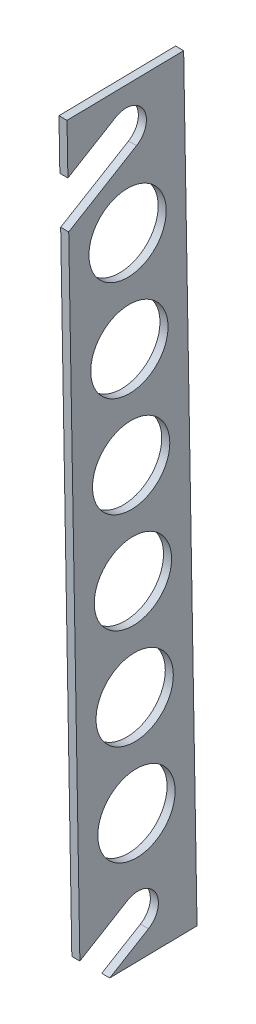
ISO-10303-21;
HEADER;
FILE_DESCRIPTION(('STEP AP214'),'2;1');
FILE_NAME('part.step','',(''),(''),'','','');
FILE_SCHEMA(('AUTOMOTIVE_DESIGN { 1 0 10303 214 1 1 1 1 }'));
ENDSEC;
DATA;
#1=APPLICATION_CONTEXT('core data for automotive mechanical design processes');
#2=APPLICATION_PROTOCOL_DEFINITION('international standard','automotive_design',2000,#1);
#3=PRODUCT_CONTEXT('',#1,'mechanical');
#4=PRODUCT('Part','Part','',(#3));
#5=PRODUCT_RELATED_PRODUCT_CATEGORY('part','',(#4));
#6=PRODUCT_DEFINITION_FORMATION('','',#4);
#7=PRODUCT_DEFINITION_CONTEXT('part definition',#1,'design');
#8=PRODUCT_DEFINITION('design','',#6,#7);
#9=PRODUCT_DEFINITION_SHAPE('','',#8);
#10=(LENGTH_UNIT() NAMED_UNIT(*) SI_UNIT(.MILLI.,.METRE.));
#11=(NAMED_UNIT(*) PLANE_ANGLE_UNIT() SI_UNIT($,.RADIAN.));
#12=(NAMED_UNIT(*) SI_UNIT($,.STERADIAN.) SOLID_ANGLE_UNIT());
#13=UNCERTAINTY_MEASURE_WITH_UNIT(LENGTH_MEASURE(1.E-05),#10,'distance_accuracy_value','');
#14=(GEOMETRIC_REPRESENTATION_CONTEXT(3) GLOBAL_UNCERTAINTY_ASSIGNED_CONTEXT((#13)) GLOBAL_UNIT_ASSIGNED_CONTEXT((#10,
#11,#12)) REPRESENTATION_CONTEXT('',''));
#15=CARTESIAN_POINT('',(0.,0.,0.));
#16=DIRECTION('',(0.,0.,1.));
#17=DIRECTION('',(1.,0.,0.));
#18=AXIS2_PLACEMENT_3D('',#15,#16,#17);
#19=CARTESIAN_POINT('',(1.5875,57.4435430699603,1.00535120490526));
#20=DIRECTION('',(1.,0.,0.));
#21=DIRECTION('',(0.,0.,-1.));
#22=AXIS2_PLACEMENT_3D('',#19,#20,#21);
#23=PLANE('',#22);
#24=CARTESIAN_POINT('',(1.5875,-39.983716875602,-0.699777134020467));
#25=DIRECTION('',(1.,0.,0.));
#26=DIRECTION('',(0.,0.,-1.));
#27=AXIS2_PLACEMENT_3D('',#24,#25,#26);
#28=CIRCLE('',#27,7.62);
#29=CARTESIAN_POINT('',(1.5875,-39.983716875602,-8.31977713402046));
#30=VERTEX_POINT('',#29);
#31=EDGE_CURVE('E330',#30,#30,#28,.T.);
#32=ORIENTED_EDGE('',*,*,#31,.F.);
#33=EDGE_LOOP('',(#32));
#34=FACE_BOUND('',#33,.T.);
#35=CARTESIAN_POINT('',(1.5875,0.,0.));
#36=DIRECTION('',(1.,0.,0.));
#37=DIRECTION('',(0.,0.,-1.));
#38=AXIS2_PLACEMENT_3D('',#35,#36,#37);
#39=CIRCLE('',#38,7.62);
#40=CARTESIAN_POINT('',(1.5875,0.,-7.62));
#41=VERTEX_POINT('',#40);
#42=EDGE_CURVE('E346',#41,#41,#39,.T.);
#43=ORIENTED_EDGE('',*,*,#42,.F.);
#44=EDGE_LOOP('',(#43));
#45=FACE_BOUND('',#44,.T.);
#46=CARTESIAN_POINT('',(1.5875,39.983716875602,0.699777134020463));
#47=DIRECTION('',(1.,0.,0.));
#48=DIRECTION('',(0.,0.,-1.));
#49=AXIS2_PLACEMENT_3D('',#46,#47,#48);
#50=CIRCLE('',#49,7.62);
#51=CARTESIAN_POINT('',(1.5875,39.983716875602,-6.92022286597954));
#52=VERTEX_POINT('',#51);
#53=EDGE_CURVE('E164',#52,#52,#50,.T.);
#54=ORIENTED_EDGE('',*,*,#53,.F.);
#55=EDGE_LOOP('',(#54));
#56=FACE_BOUND('',#55,.T.);
#57=DIRECTION('',(0.,-0.0174988730642705,0.999846882998332));
#58=VECTOR('',#57,1.);
#59=CARTESIAN_POINT('',(1.5875,65.5810647439988,-10.3539906446279));
#60=LINE('',#59,#58);
#61=CARTESIAN_POINT('',(1.5875,65.5810647439988,-10.3539906446279));
#62=VERTEX_POINT('',#61);
#63=CARTESIAN_POINT('',(1.5875,65.1785906635205,12.6424876643337));
#64=VERTEX_POINT('',#63);
#65=EDGE_CURVE('E191',#62,#64,#60,.T.);
#66=ORIENTED_EDGE('',*,*,#65,.T.);
#67=DIRECTION('',(0.,-0.999846882998332,-0.0174988730642702));
#68=VECTOR('',#67,1.);
#69=CARTESIAN_POINT('',(1.5875,65.1785906635205,12.6424876643337));
#70=LINE('',#69,#68);
#71=CARTESIAN_POINT('',(1.5875,55.2444604340565,12.4686249591083));
#72=VERTEX_POINT('',#71);
#73=EDGE_CURVE('E108',#64,#72,#70,.T.);
#74=ORIENTED_EDGE('',*,*,#73,.T.);
#75=DIRECTION('',(0.,0.515077910110425,-0.857143364039107));
#76=VECTOR('',#75,1.);
#77=CARTESIAN_POINT('',(1.5875,60.8888736788837,3.07573261848962));
#78=LINE('',#77,#76);
#79=CARTESIAN_POINT('',(1.5875,60.8888736788837,3.07573261848962));
#80=VERTEX_POINT('',#79);
#81=EDGE_CURVE('E225',#72,#80,#78,.T.);
#82=ORIENTED_EDGE('',*,*,#81,.T.);
#83=CARTESIAN_POINT('',(1.5875,57.4435430699603,1.00535120490526));
#84=DIRECTION('',(-1.,0.,0.));
#85=DIRECTION('',(0.,0.,-1.));
#86=AXIS2_PLACEMENT_3D('',#83,#84,#85);
#87=CIRCLE('',#86,4.01955000000001);
#88=CARTESIAN_POINT('',(1.5875,53.9982124610369,-1.06503020867909));
#89=VERTEX_POINT('',#88);
#90=EDGE_CURVE('E245',#80,#89,#87,.T.);
#91=ORIENTED_EDGE('',*,*,#90,.T.);
#92=DIRECTION('',(0.,-0.515077910110424,0.857143364039107));
#93=VECTOR('',#92,1.);
#94=CARTESIAN_POINT('',(1.5875,53.9982124610369,-1.06503020867909));
#95=LINE('',#94,#93);
#96=CARTESIAN_POINT('',(1.5875,45.9631286832935,12.306187240958));
#97=VERTEX_POINT('',#96);
#98=EDGE_CURVE('E241',#89,#97,#95,.T.);
#99=ORIENTED_EDGE('',*,*,#98,.T.);
#100=DIRECTION('',(0.,-0.999846882998332,-0.0174988730642701));
#101=VECTOR('',#100,1.);
#102=CARTESIAN_POINT('',(1.5875,45.9631286832935,12.306187240958));
#103=LINE('',#102,#101);
#104=CARTESIAN_POINT('',(1.5875,-79.6344841436652,10.1080339822875));
#105=VERTEX_POINT('',#104);
#106=EDGE_CURVE('E244',#97,#105,#103,.T.);
#107=ORIENTED_EDGE('',*,*,#106,.T.);
#108=DIRECTION('',(0.,0.515077910110422,-0.857143364039109));
#109=VECTOR('',#108,1.);
#110=CARTESIAN_POINT('',(1.5875,-73.9900708988381,0.715141641668824));
#111=LINE('',#110,#109);
#112=CARTESIAN_POINT('',(1.5875,-73.9900708988381,0.715141641668824));
#113=VERTEX_POINT('',#112);
#114=EDGE_CURVE('E250',#105,#113,#111,.T.);
#115=ORIENTED_EDGE('',*,*,#114,.T.);
#116=CARTESIAN_POINT('',(1.5875,-77.4354015077614,-1.35523977191552));
#117=DIRECTION('',(-1.,0.,0.));
#118=DIRECTION('',(0.,0.,-1.));
#119=AXIS2_PLACEMENT_3D('',#116,#117,#118);
#120=CIRCLE('',#119,4.01954999999998);
#121=CARTESIAN_POINT('',(1.5875,-80.8807321166848,-3.42562118549985));
#122=VERTEX_POINT('',#121);
#123=EDGE_CURVE('E136',#113,#122,#120,.T.);
#124=ORIENTED_EDGE('',*,*,#123,.T.);
#125=DIRECTION('',(0.,-0.515077910110422,0.857143364039108));
#126=VECTOR('',#125,1.);
#127=CARTESIAN_POINT('',(1.5875,-80.8807321166848,-3.42562118549986));
#128=LINE('',#127,#126);
#129=CARTESIAN_POINT('',(1.5875,-85.4715881403134,4.21404205509341));
#130=VERTEX_POINT('',#129);
#131=EDGE_CURVE('E130',#122,#130,#128,.T.);
#132=ORIENTED_EDGE('',*,*,#131,.T.);
#133=DIRECTION('',(0.,0.0174988730642703,-0.999846882998332));
#134=VECTOR('',#133,1.);
#135=CARTESIAN_POINT('',(1.5875,-85.4715881403134,4.21404205509341));
#136=LINE('',#135,#134);
#137=CARTESIAN_POINT('',(1.5875,-85.1704491013216,-12.992376231344));
#138=VERTEX_POINT('',#137);
#139=EDGE_CURVE('E134',#130,#138,#136,.T.);
#140=ORIENTED_EDGE('',*,*,#139,.T.);
#141=DIRECTION('',(0.,0.999846882998332,0.01749887306427));
#142=VECTOR('',#141,1.);
#143=CARTESIAN_POINT('',(1.5875,-85.1704491013216,-12.992376231344));
#144=LINE('',#143,#142);
#145=EDGE_CURVE('E56',#138,#62,#144,.T.);
#146=ORIENTED_EDGE('',*,*,#145,.T.);
#147=EDGE_LOOP('',(#66,#74,#82,#91,#99,#107,#115,#124,#132,#140,#146));
#148=FACE_BOUND('',#147,.T.);
#149=CARTESIAN_POINT('',(1.5875,19.991858437801,0.349888567010234));
#150=DIRECTION('',(1.,0.,0.));
#151=DIRECTION('',(0.,0.,-1.));
#152=AXIS2_PLACEMENT_3D('',#149,#150,#151);
#153=CIRCLE('',#152,7.62000000000001);
#154=CARTESIAN_POINT('',(1.5875,19.991858437801,-7.27011143298977));
#155=VERTEX_POINT('',#154);
#156=EDGE_CURVE('E354',#155,#155,#153,.T.);
#157=ORIENTED_EDGE('',*,*,#156,.F.);
#158=EDGE_LOOP('',(#157));
#159=FACE_BOUND('',#158,.T.);
#160=CARTESIAN_POINT('',(1.5875,-19.991858437801,-0.349888567010234));
#161=DIRECTION('',(1.,0.,0.));
#162=DIRECTION('',(0.,0.,-1.));
#163=AXIS2_PLACEMENT_3D('',#160,#161,#162);
#164=CIRCLE('',#163,7.62);
#165=CARTESIAN_POINT('',(1.5875,-19.991858437801,-7.96988856701023));
#166=VERTEX_POINT('',#165);
#167=EDGE_CURVE('E338',#166,#166,#164,.T.);
#168=ORIENTED_EDGE('',*,*,#167,.F.);
#169=EDGE_LOOP('',(#168));
#170=FACE_BOUND('',#169,.T.);
#171=CARTESIAN_POINT('',(1.5875,-59.975575313403,-1.0496657010307));
#172=DIRECTION('',(1.,0.,0.));
#173=DIRECTION('',(0.,0.,-1.));
#174=AXIS2_PLACEMENT_3D('',#171,#172,#173);
#175=CIRCLE('',#174,7.62);
#176=CARTESIAN_POINT('',(1.5875,-59.975575313403,-8.6696657010307));
#177=VERTEX_POINT('',#176);
#178=EDGE_CURVE('E318',#177,#177,#175,.T.);
#179=ORIENTED_EDGE('',*,*,#178,.F.);
#180=EDGE_LOOP('',(#179));
#181=FACE_BOUND('',#180,.T.);
#182=ADVANCED_FACE('F38',(#34,#45,#56,#148,#159,#170,#181),#23,.T.);
#183=CARTESIAN_POINT('',(0.,57.4435430699603,1.00535120490526));
#184=DIRECTION('',(1.,0.,0.));
#185=DIRECTION('',(0.,0.,-1.));
#186=AXIS2_PLACEMENT_3D('',#183,#184,#185);
#187=PLANE('',#186);
#188=DIRECTION('',(0.,-0.0174988730642705,0.999846882998332));
#189=VECTOR('',#188,1.);
#190=CARTESIAN_POINT('',(0.,65.5810647439988,-10.3539906446279));
#191=LINE('',#190,#189);
#192=CARTESIAN_POINT('',(0.,65.5810647439988,-10.3539906446279));
#193=VERTEX_POINT('',#192);
#194=CARTESIAN_POINT('',(0.,65.1785906635205,12.6424876643337));
#195=VERTEX_POINT('',#194);
#196=EDGE_CURVE('E159',#193,#195,#191,.T.);
#197=ORIENTED_EDGE('',*,*,#196,.F.);
#198=DIRECTION('',(0.,0.999846882998332,0.01749887306427));
#199=VECTOR('',#198,1.);
#200=CARTESIAN_POINT('',(0.,-85.1704491013216,-12.992376231344));
#201=LINE('',#200,#199);
#202=CARTESIAN_POINT('',(0.,-85.1704491013216,-12.992376231344));
#203=VERTEX_POINT('',#202);
#204=EDGE_CURVE('E100',#203,#193,#201,.T.);
#205=ORIENTED_EDGE('',*,*,#204,.F.);
#206=DIRECTION('',(0.,0.0174988730642703,-0.999846882998332));
#207=VECTOR('',#206,1.);
#208=CARTESIAN_POINT('',(0.,-85.4715881403134,4.21404205509341));
#209=LINE('',#208,#207);
#210=CARTESIAN_POINT('',(0.,-85.4715881403134,4.21404205509341));
#211=VERTEX_POINT('',#210);
#212=EDGE_CURVE('E94',#211,#203,#209,.T.);
#213=ORIENTED_EDGE('',*,*,#212,.F.);
#214=DIRECTION('',(0.,-0.515077910110422,0.857143364039108));
#215=VECTOR('',#214,1.);
#216=CARTESIAN_POINT('',(0.,-80.8807321166848,-3.42562118549986));
#217=LINE('',#216,#215);
#218=CARTESIAN_POINT('',(0.,-80.8807321166848,-3.42562118549985));
#219=VERTEX_POINT('',#218);
#220=EDGE_CURVE('E145',#219,#211,#217,.T.);
#221=ORIENTED_EDGE('',*,*,#220,.F.);
#222=CARTESIAN_POINT('',(0.,-77.4354015077614,-1.35523977191552));
#223=DIRECTION('',(-1.,0.,0.));
#224=DIRECTION('',(0.,0.,-1.));
#225=AXIS2_PLACEMENT_3D('',#222,#223,#224);
#226=CIRCLE('',#225,4.01954999999998);
#227=CARTESIAN_POINT('',(0.,-73.9900708988381,0.715141641668824));
#228=VERTEX_POINT('',#227);
#229=EDGE_CURVE('E182',#228,#219,#226,.T.);
#230=ORIENTED_EDGE('',*,*,#229,.F.);
#231=DIRECTION('',(0.,0.515077910110422,-0.857143364039109));
#232=VECTOR('',#231,1.);
#233=CARTESIAN_POINT('',(0.,-73.9900708988381,0.715141641668824));
#234=LINE('',#233,#232);
#235=CARTESIAN_POINT('',(0.,-79.6344841436652,10.1080339822875));
#236=VERTEX_POINT('',#235);
#237=EDGE_CURVE('E179',#236,#228,#234,.T.);
#238=ORIENTED_EDGE('',*,*,#237,.F.);
#239=DIRECTION('',(0.,-0.999846882998332,-0.0174988730642701));
#240=VECTOR('',#239,1.);
#241=CARTESIAN_POINT('',(0.,45.9631286832935,12.306187240958));
#242=LINE('',#241,#240);
#243=CARTESIAN_POINT('',(0.,45.9631286832935,12.306187240958));
#244=VERTEX_POINT('',#243);
#245=EDGE_CURVE('E176',#244,#236,#242,.T.);
#246=ORIENTED_EDGE('',*,*,#245,.F.);
#247=DIRECTION('',(0.,-0.515077910110424,0.857143364039107));
#248=VECTOR('',#247,1.);
#249=CARTESIAN_POINT('',(0.,53.9982124610369,-1.06503020867909));
#250=LINE('',#249,#248);
#251=CARTESIAN_POINT('',(0.,53.9982124610369,-1.06503020867909));
#252=VERTEX_POINT('',#251);
#253=EDGE_CURVE('E173',#252,#244,#250,.T.);
#254=ORIENTED_EDGE('',*,*,#253,.F.);
#255=CARTESIAN_POINT('',(0.,57.4435430699603,1.00535120490526));
#256=DIRECTION('',(-1.,0.,0.));
#257=DIRECTION('',(0.,0.,-1.));
#258=AXIS2_PLACEMENT_3D('',#255,#256,#257);
#259=CIRCLE('',#258,4.01955000000001);
#260=CARTESIAN_POINT('',(0.,60.8888736788837,3.07573261848962));
#261=VERTEX_POINT('',#260);
#262=EDGE_CURVE('E170',#261,#252,#259,.T.);
#263=ORIENTED_EDGE('',*,*,#262,.F.);
#264=DIRECTION('',(0.,0.515077910110425,-0.857143364039107));
#265=VECTOR('',#264,1.);
#266=CARTESIAN_POINT('',(0.,60.8888736788837,3.07573261848962));
#267=LINE('',#266,#265);
#268=CARTESIAN_POINT('',(0.,55.2444604340565,12.4686249591083));
#269=VERTEX_POINT('',#268);
#270=EDGE_CURVE('E167',#269,#261,#267,.T.);
#271=ORIENTED_EDGE('',*,*,#270,.F.);
#272=DIRECTION('',(0.,-0.999846882998332,-0.0174988730642702));
#273=VECTOR('',#272,1.);
#274=CARTESIAN_POINT('',(0.,65.1785906635205,12.6424876643337));
#275=LINE('',#274,#273);
#276=EDGE_CURVE('E163',#195,#269,#275,.T.);
#277=ORIENTED_EDGE('',*,*,#276,.F.);
#278=EDGE_LOOP('',(#197,#205,#213,#221,#230,#238,#246,#254,#263,#271,#277));
#279=FACE_BOUND('',#278,.T.);
#280=CARTESIAN_POINT('',(0.,39.983716875602,0.699777134020463));
#281=DIRECTION('',(1.,0.,0.));
#282=DIRECTION('',(0.,0.,-1.));
#283=AXIS2_PLACEMENT_3D('',#280,#281,#282);
#284=CIRCLE('',#283,7.62);
#285=CARTESIAN_POINT('',(0.,39.983716875602,-6.92022286597954));
#286=VERTEX_POINT('',#285);
#287=EDGE_CURVE('E358',#286,#286,#284,.T.);
#288=ORIENTED_EDGE('',*,*,#287,.T.);
#289=EDGE_LOOP('',(#288));
#290=FACE_BOUND('',#289,.T.);
#291=CARTESIAN_POINT('',(0.,19.991858437801,0.349888567010234));
#292=DIRECTION('',(1.,0.,0.));
#293=DIRECTION('',(0.,0.,-1.));
#294=AXIS2_PLACEMENT_3D('',#291,#292,#293);
#295=CIRCLE('',#294,7.62000000000001);
#296=CARTESIAN_POINT('',(0.,19.991858437801,-7.27011143298977));
#297=VERTEX_POINT('',#296);
#298=EDGE_CURVE('E350',#297,#297,#295,.T.);
#299=ORIENTED_EDGE('',*,*,#298,.T.);
#300=EDGE_LOOP('',(#299));
#301=FACE_BOUND('',#300,.T.);
#302=CARTESIAN_POINT('',(0.,0.,0.));
#303=DIRECTION('',(1.,0.,0.));
#304=DIRECTION('',(0.,0.,-1.));
#305=AXIS2_PLACEMENT_3D('',#302,#303,#304);
#306=CIRCLE('',#305,7.62);
#307=CARTESIAN_POINT('',(0.,0.,-7.62));
#308=VERTEX_POINT('',#307);
#309=EDGE_CURVE('E342',#308,#308,#306,.T.);
#310=ORIENTED_EDGE('',*,*,#309,.T.);
#311=EDGE_LOOP('',(#310));
#312=FACE_BOUND('',#311,.T.);
#313=CARTESIAN_POINT('',(0.,-19.991858437801,-0.349888567010234));
#314=DIRECTION('',(1.,0.,0.));
#315=DIRECTION('',(0.,0.,-1.));
#316=AXIS2_PLACEMENT_3D('',#313,#314,#315);
#317=CIRCLE('',#316,7.62);
#318=CARTESIAN_POINT('',(0.,-19.991858437801,-7.96988856701023));
#319=VERTEX_POINT('',#318);
#320=EDGE_CURVE('E334',#319,#319,#317,.T.);
#321=ORIENTED_EDGE('',*,*,#320,.T.);
#322=EDGE_LOOP('',(#321));
#323=FACE_BOUND('',#322,.T.);
#324=CARTESIAN_POINT('',(0.,-39.983716875602,-0.699777134020467));
#325=DIRECTION('',(1.,0.,0.));
#326=DIRECTION('',(0.,0.,-1.));
#327=AXIS2_PLACEMENT_3D('',#324,#325,#326);
#328=CIRCLE('',#327,7.62);
#329=CARTESIAN_POINT('',(0.,-39.983716875602,-8.31977713402046));
#330=VERTEX_POINT('',#329);
#331=EDGE_CURVE('E327',#330,#330,#328,.T.);
#332=ORIENTED_EDGE('',*,*,#331,.T.);
#333=EDGE_LOOP('',(#332));
#334=FACE_BOUND('',#333,.T.);
#335=CARTESIAN_POINT('',(0.,-59.975575313403,-1.0496657010307));
#336=DIRECTION('',(1.,0.,0.));
#337=DIRECTION('',(0.,0.,-1.));
#338=AXIS2_PLACEMENT_3D('',#335,#336,#337);
#339=CIRCLE('',#338,7.62);
#340=CARTESIAN_POINT('',(0.,-59.975575313403,-8.6696657010307));
#341=VERTEX_POINT('',#340);
#342=EDGE_CURVE('E321',#341,#341,#339,.T.);
#343=ORIENTED_EDGE('',*,*,#342,.T.);
#344=EDGE_LOOP('',(#343));
#345=FACE_BOUND('',#344,.T.);
#346=ADVANCED_FACE('F229',(#279,#290,#301,#312,#323,#334,#345),#187,.F.);
#347=CARTESIAN_POINT('',(1.5875,65.5810647439988,-10.3539906446279));
#348=DIRECTION('',(0.,-0.999846882998332,-0.0174988730642705));
#349=DIRECTION('',(0.,0.0174988730642705,-0.999846882998332));
#350=AXIS2_PLACEMENT_3D('',#347,#348,#349);
#351=PLANE('',#350);
#352=ORIENTED_EDGE('',*,*,#196,.T.);
#353=DIRECTION('',(-1.,0.,0.));
#354=VECTOR('',#353,1.);
#355=CARTESIAN_POINT('',(1.5875,65.1785906635205,12.6424876643337));
#356=LINE('',#355,#354);
#357=EDGE_CURVE('E11',#64,#195,#356,.T.);
#358=ORIENTED_EDGE('',*,*,#357,.F.);
#359=ORIENTED_EDGE('',*,*,#65,.F.);
#360=DIRECTION('',(-1.,0.,0.));
#361=VECTOR('',#360,1.);
#362=CARTESIAN_POINT('',(1.5875,65.5810647439988,-10.3539906446279));
#363=LINE('',#362,#361);
#364=EDGE_CURVE('E155',#62,#193,#363,.T.);
#365=ORIENTED_EDGE('',*,*,#364,.T.);
#366=EDGE_LOOP('',(#352,#358,#359,#365));
#367=FACE_BOUND('',#366,.T.);
#368=ADVANCED_FACE('F40',(#367),#351,.F.);
#369=CARTESIAN_POINT('',(1.5875,65.1785906635205,12.6424876643337));
#370=DIRECTION('',(0.,0.0174988730642702,-0.999846882998332));
#371=DIRECTION('',(0.,0.999846882998332,0.0174988730642702));
#372=AXIS2_PLACEMENT_3D('',#369,#370,#371);
#373=PLANE('',#372);
#374=ORIENTED_EDGE('',*,*,#276,.T.);
#375=DIRECTION('',(-1.,0.,0.));
#376=VECTOR('',#375,1.);
#377=CARTESIAN_POINT('',(1.5875,55.2444604340565,12.4686249591083));
#378=LINE('',#377,#376);
#379=EDGE_CURVE('E48',#72,#269,#378,.T.);
#380=ORIENTED_EDGE('',*,*,#379,.F.);
#381=ORIENTED_EDGE('',*,*,#73,.F.);
#382=ORIENTED_EDGE('',*,*,#357,.T.);
#383=EDGE_LOOP('',(#374,#380,#381,#382));
#384=FACE_BOUND('',#383,.T.);
#385=ADVANCED_FACE('F508',(#384),#373,.F.);
#386=CARTESIAN_POINT('',(1.5875,60.8888736788837,3.07573261848962));
#387=DIRECTION('',(0.,0.857143364039107,0.515077910110425));
#388=DIRECTION('',(0.,-0.515077910110425,0.857143364039107));
#389=AXIS2_PLACEMENT_3D('',#386,#387,#388);
#390=PLANE('',#389);
#391=ORIENTED_EDGE('',*,*,#270,.T.);
#392=DIRECTION('',(-1.,0.,0.));
#393=VECTOR('',#392,1.);
#394=CARTESIAN_POINT('',(1.5875,60.8888736788837,3.07573261848962));
#395=LINE('',#394,#393);
#396=EDGE_CURVE('E214',#80,#261,#395,.T.);
#397=ORIENTED_EDGE('',*,*,#396,.F.);
#398=ORIENTED_EDGE('',*,*,#81,.F.);
#399=ORIENTED_EDGE('',*,*,#379,.T.);
#400=EDGE_LOOP('',(#391,#397,#398,#399));
#401=FACE_BOUND('',#400,.T.);
#402=ADVANCED_FACE('F223',(#401),#390,.F.);
#403=CARTESIAN_POINT('',(1.5875,57.4435430699603,1.00535120490526));
#404=DIRECTION('',(-1.,0.,0.));
#405=DIRECTION('',(0.,0.,1.));
#406=AXIS2_PLACEMENT_3D('',#403,#404,#405);
#407=CYLINDRICAL_SURFACE('',#406,4.01955000000001);
#408=ORIENTED_EDGE('',*,*,#262,.T.);
#409=DIRECTION('',(-1.,0.,0.));
#410=VECTOR('',#409,1.);
#411=CARTESIAN_POINT('',(1.5875,53.9982124610369,-1.06503020867909));
#412=LINE('',#411,#410);
#413=EDGE_CURVE('E210',#89,#252,#412,.T.);
#414=ORIENTED_EDGE('',*,*,#413,.F.);
#415=ORIENTED_EDGE('',*,*,#90,.F.);
#416=ORIENTED_EDGE('',*,*,#396,.T.);
#417=EDGE_LOOP('',(#408,#414,#415,#416));
#418=FACE_BOUND('',#417,.T.);
#419=ADVANCED_FACE('F235',(#418),#407,.F.);
#420=CARTESIAN_POINT('',(1.5875,53.9982124610369,-1.06503020867909));
#421=DIRECTION('',(0.,-0.857143364039107,-0.515077910110424));
#422=DIRECTION('',(0.,0.515077910110424,-0.857143364039107));
#423=AXIS2_PLACEMENT_3D('',#420,#421,#422);
#424=PLANE('',#423);
#425=ORIENTED_EDGE('',*,*,#253,.T.);
#426=DIRECTION('',(-1.,0.,0.));
#427=VECTOR('',#426,1.);
#428=CARTESIAN_POINT('',(1.5875,45.9631286832935,12.306187240958));
#429=LINE('',#428,#427);
#430=EDGE_CURVE('E206',#97,#244,#429,.T.);
#431=ORIENTED_EDGE('',*,*,#430,.F.);
#432=ORIENTED_EDGE('',*,*,#98,.F.);
#433=ORIENTED_EDGE('',*,*,#413,.T.);
#434=EDGE_LOOP('',(#425,#431,#432,#433));
#435=FACE_BOUND('',#434,.T.);
#436=ADVANCED_FACE('F239',(#435),#424,.F.);
#437=CARTESIAN_POINT('',(1.5875,45.9631286832935,12.306187240958));
#438=DIRECTION('',(0.,0.0174988730642701,-0.999846882998332));
#439=DIRECTION('',(0.,0.999846882998332,0.0174988730642701));
#440=AXIS2_PLACEMENT_3D('',#437,#438,#439);
#441=PLANE('',#440);
#442=ORIENTED_EDGE('',*,*,#245,.T.);
#443=DIRECTION('',(-1.,0.,0.));
#444=VECTOR('',#443,1.);
#445=CARTESIAN_POINT('',(1.5875,-79.6344841436652,10.1080339822875));
#446=LINE('',#445,#444);
#447=EDGE_CURVE('E202',#105,#236,#446,.T.);
#448=ORIENTED_EDGE('',*,*,#447,.F.);
#449=ORIENTED_EDGE('',*,*,#106,.F.);
#450=ORIENTED_EDGE('',*,*,#430,.T.);
#451=EDGE_LOOP('',(#442,#448,#449,#450));
#452=FACE_BOUND('',#451,.T.);
#453=ADVANCED_FACE('F474',(#452),#441,.F.);
#454=CARTESIAN_POINT('',(1.5875,-73.9900708988381,0.715141641668824));
#455=DIRECTION('',(0.,0.857143364039109,0.515077910110422));
#456=DIRECTION('',(0.,-0.515077910110422,0.857143364039109));
#457=AXIS2_PLACEMENT_3D('',#454,#455,#456);
#458=PLANE('',#457);
#459=ORIENTED_EDGE('',*,*,#237,.T.);
#460=DIRECTION('',(-1.,0.,0.));
#461=VECTOR('',#460,1.);
#462=CARTESIAN_POINT('',(1.5875,-73.9900708988381,0.715141641668824));
#463=LINE('',#462,#461);
#464=EDGE_CURVE('E198',#113,#228,#463,.T.);
#465=ORIENTED_EDGE('',*,*,#464,.F.);
#466=ORIENTED_EDGE('',*,*,#114,.F.);
#467=ORIENTED_EDGE('',*,*,#447,.T.);
#468=EDGE_LOOP('',(#459,#465,#466,#467));
#469=FACE_BOUND('',#468,.T.);
#470=ADVANCED_FACE('F265',(#469),#458,.F.);
#471=CARTESIAN_POINT('',(1.5875,-77.4354015077614,-1.35523977191552));
#472=DIRECTION('',(-1.,0.,0.));
#473=DIRECTION('',(0.,0.,1.));
#474=AXIS2_PLACEMENT_3D('',#471,#472,#473);
#475=CYLINDRICAL_SURFACE('',#474,4.01954999999998);
#476=ORIENTED_EDGE('',*,*,#229,.T.);
#477=DIRECTION('',(-1.,0.,0.));
#478=VECTOR('',#477,1.);
#479=CARTESIAN_POINT('',(1.5875,-80.8807321166848,-3.42562118549985));
#480=LINE('',#479,#478);
#481=EDGE_CURVE('E147',#122,#219,#480,.T.);
#482=ORIENTED_EDGE('',*,*,#481,.F.);
#483=ORIENTED_EDGE('',*,*,#123,.F.);
#484=ORIENTED_EDGE('',*,*,#464,.T.);
#485=EDGE_LOOP('',(#476,#482,#483,#484));
#486=FACE_BOUND('',#485,.T.);
#487=ADVANCED_FACE('F269',(#486),#475,.F.);
#488=CARTESIAN_POINT('',(1.5875,-80.8807321166848,-3.42562118549986));
#489=DIRECTION('',(0.,-0.857143364039108,-0.515077910110422));
#490=DIRECTION('',(0.,0.515077910110422,-0.857143364039109));
#491=AXIS2_PLACEMENT_3D('',#488,#489,#490);
#492=PLANE('',#491);
#493=ORIENTED_EDGE('',*,*,#220,.T.);
#494=DIRECTION('',(-1.,0.,0.));
#495=VECTOR('',#494,1.);
#496=CARTESIAN_POINT('',(1.5875,-85.4715881403134,4.21404205509341));
#497=LINE('',#496,#495);
#498=EDGE_CURVE('E142',#130,#211,#497,.T.);
#499=ORIENTED_EDGE('',*,*,#498,.F.);
#500=ORIENTED_EDGE('',*,*,#131,.F.);
#501=ORIENTED_EDGE('',*,*,#481,.T.);
#502=EDGE_LOOP('',(#493,#499,#500,#501));
#503=FACE_BOUND('',#502,.T.);
#504=ADVANCED_FACE('F143',(#503),#492,.F.);
#505=CARTESIAN_POINT('',(1.5875,-85.4715881403134,4.21404205509341));
#506=DIRECTION('',(0.,0.999846882998332,0.0174988730642703));
#507=DIRECTION('',(0.,-0.0174988730642703,0.999846882998332));
#508=AXIS2_PLACEMENT_3D('',#505,#506,#507);
#509=PLANE('',#508);
#510=ORIENTED_EDGE('',*,*,#212,.T.);
#511=DIRECTION('',(-1.,0.,0.));
#512=VECTOR('',#511,1.);
#513=CARTESIAN_POINT('',(1.5875,-85.1704491013216,-12.992376231344));
#514=LINE('',#513,#512);
#515=EDGE_CURVE('E148',#138,#203,#514,.T.);
#516=ORIENTED_EDGE('',*,*,#515,.F.);
#517=ORIENTED_EDGE('',*,*,#139,.F.);
#518=ORIENTED_EDGE('',*,*,#498,.T.);
#519=EDGE_LOOP('',(#510,#516,#517,#518));
#520=FACE_BOUND('',#519,.T.);
#521=ADVANCED_FACE('F150',(#520),#509,.F.);
#522=CARTESIAN_POINT('',(1.5875,-85.1704491013216,-12.992376231344));
#523=DIRECTION('',(0.,-0.01749887306427,0.999846882998332));
#524=DIRECTION('',(0.,-0.999846882998332,-0.01749887306427));
#525=AXIS2_PLACEMENT_3D('',#522,#523,#524);
#526=PLANE('',#525);
#527=ORIENTED_EDGE('',*,*,#204,.T.);
#528=ORIENTED_EDGE('',*,*,#364,.F.);
#529=ORIENTED_EDGE('',*,*,#145,.F.);
#530=ORIENTED_EDGE('',*,*,#515,.T.);
#531=EDGE_LOOP('',(#527,#528,#529,#530));
#532=FACE_BOUND('',#531,.T.);
#533=ADVANCED_FACE('F273',(#532),#526,.F.);
#534=CARTESIAN_POINT('',(1.5875,39.983716875602,0.699777134020463));
#535=DIRECTION('',(-1.,0.,0.));
#536=DIRECTION('',(0.,0.,1.));
#537=AXIS2_PLACEMENT_3D('',#534,#535,#536);
#538=CYLINDRICAL_SURFACE('',#537,7.62);
#539=ORIENTED_EDGE('',*,*,#53,.T.);
#540=EDGE_LOOP('',(#539));
#541=FACE_BOUND('',#540,.T.);
#542=ORIENTED_EDGE('',*,*,#287,.F.);
#543=EDGE_LOOP('',(#542));
#544=FACE_BOUND('',#543,.T.);
#545=ADVANCED_FACE('F275',(#541,#544),#538,.F.);
#546=CARTESIAN_POINT('',(1.5875,19.991858437801,0.349888567010234));
#547=DIRECTION('',(-1.,0.,0.));
#548=DIRECTION('',(0.,0.,1.));
#549=AXIS2_PLACEMENT_3D('',#546,#547,#548);
#550=CYLINDRICAL_SURFACE('',#549,7.62000000000001);
#551=ORIENTED_EDGE('',*,*,#156,.T.);
#552=EDGE_LOOP('',(#551));
#553=FACE_BOUND('',#552,.T.);
#554=ORIENTED_EDGE('',*,*,#298,.F.);
#555=EDGE_LOOP('',(#554));
#556=FACE_BOUND('',#555,.T.);
#557=ADVANCED_FACE('F281',(#553,#556),#550,.F.);
#558=CARTESIAN_POINT('',(1.5875,0.,0.));
#559=DIRECTION('',(-1.,0.,0.));
#560=DIRECTION('',(0.,0.,1.));
#561=AXIS2_PLACEMENT_3D('',#558,#559,#560);
#562=CYLINDRICAL_SURFACE('',#561,7.62);
#563=ORIENTED_EDGE('',*,*,#42,.T.);
#564=EDGE_LOOP('',(#563));
#565=FACE_BOUND('',#564,.T.);
#566=ORIENTED_EDGE('',*,*,#309,.F.);
#567=EDGE_LOOP('',(#566));
#568=FACE_BOUND('',#567,.T.);
#569=ADVANCED_FACE('F297',(#565,#568),#562,.F.);
#570=CARTESIAN_POINT('',(1.5875,-19.991858437801,-0.349888567010234));
#571=DIRECTION('',(-1.,0.,0.));
#572=DIRECTION('',(0.,0.,1.));
#573=AXIS2_PLACEMENT_3D('',#570,#571,#572);
#574=CYLINDRICAL_SURFACE('',#573,7.62);
#575=ORIENTED_EDGE('',*,*,#167,.T.);
#576=EDGE_LOOP('',(#575));
#577=FACE_BOUND('',#576,.T.);
#578=ORIENTED_EDGE('',*,*,#320,.F.);
#579=EDGE_LOOP('',(#578));
#580=FACE_BOUND('',#579,.T.);
#581=ADVANCED_FACE('F301',(#577,#580),#574,.F.);
#582=CARTESIAN_POINT('',(1.5875,-39.983716875602,-0.699777134020467));
#583=DIRECTION('',(-1.,0.,0.));
#584=DIRECTION('',(0.,0.,1.));
#585=AXIS2_PLACEMENT_3D('',#582,#583,#584);
#586=CYLINDRICAL_SURFACE('',#585,7.62);
#587=ORIENTED_EDGE('',*,*,#31,.T.);
#588=EDGE_LOOP('',(#587));
#589=FACE_BOUND('',#588,.T.);
#590=ORIENTED_EDGE('',*,*,#331,.F.);
#591=EDGE_LOOP('',(#590));
#592=FACE_BOUND('',#591,.T.);
#593=ADVANCED_FACE('F305',(#589,#592),#586,.F.);
#594=CARTESIAN_POINT('',(1.5875,-59.975575313403,-1.0496657010307));
#595=DIRECTION('',(-1.,0.,0.));
#596=DIRECTION('',(0.,0.,1.));
#597=AXIS2_PLACEMENT_3D('',#594,#595,#596);
#598=CYLINDRICAL_SURFACE('',#597,7.62);
#599=ORIENTED_EDGE('',*,*,#178,.T.);
#600=EDGE_LOOP('',(#599));
#601=FACE_BOUND('',#600,.T.);
#602=ORIENTED_EDGE('',*,*,#342,.F.);
#603=EDGE_LOOP('',(#602));
#604=FACE_BOUND('',#603,.T.);
#605=ADVANCED_FACE('F309',(#601,#604),#598,.F.);
#606=CLOSED_SHELL('',(#182,#346,#368,#385,#402,#419,#436,#453,#470,#487,#504,#521,#533,#545,
#557,#569,#581,#593,#605));
#607=MANIFOLD_SOLID_BREP('B2',#606);
#608=ADVANCED_BREP_SHAPE_REPRESENTATION('',(#18,#607),#14);
#609=SHAPE_DEFINITION_REPRESENTATION(#9,#608);
ENDSEC;
END-ISO-10303-21;
